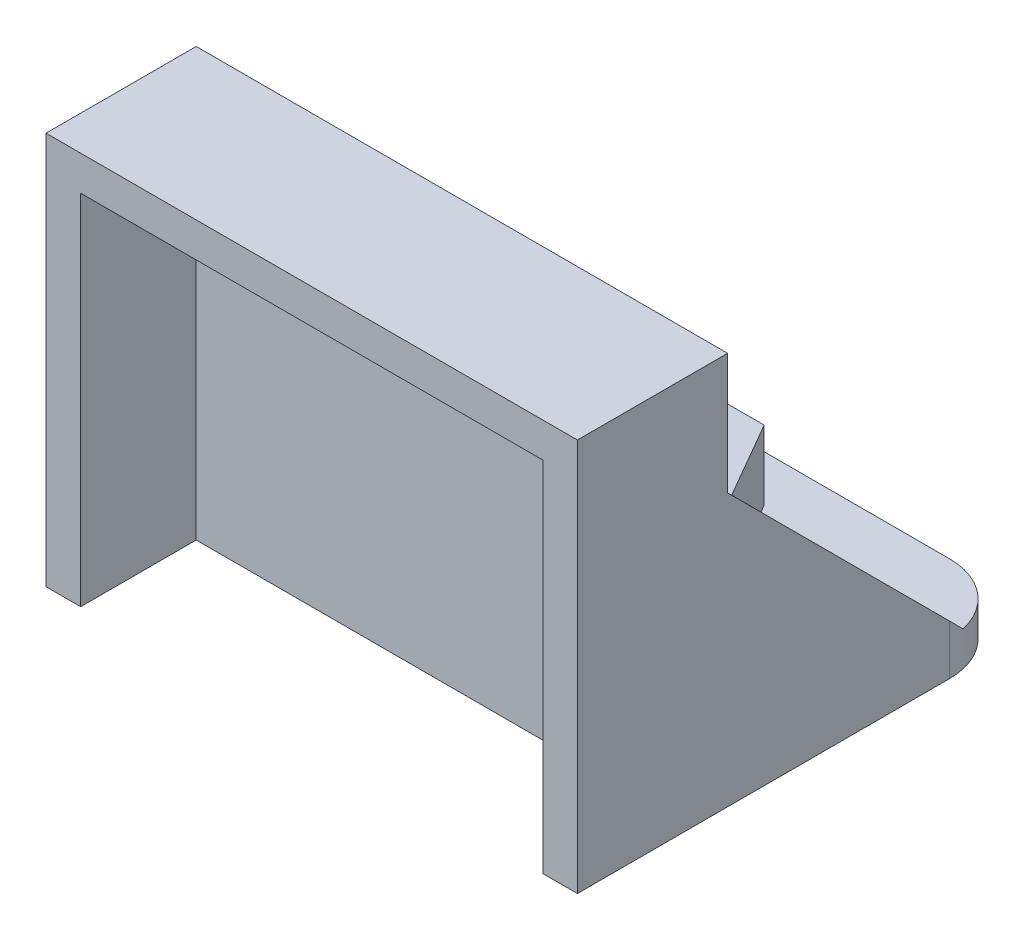
ISO-10303-21;
HEADER;
FILE_DESCRIPTION(('STEP AP214'),'2;1');
FILE_NAME('part.step','',(''),(''),'','','');
FILE_SCHEMA(('AUTOMOTIVE_DESIGN { 1 0 10303 214 1 1 1 1 }'));
ENDSEC;
DATA;
#1=APPLICATION_CONTEXT('core data for automotive mechanical design processes');
#2=APPLICATION_PROTOCOL_DEFINITION('international standard','automotive_design',2000,#1);
#3=PRODUCT_CONTEXT('',#1,'mechanical');
#4=PRODUCT('Part','Part','',(#3));
#5=PRODUCT_RELATED_PRODUCT_CATEGORY('part','',(#4));
#6=PRODUCT_DEFINITION_FORMATION('','',#4);
#7=PRODUCT_DEFINITION_CONTEXT('part definition',#1,'design');
#8=PRODUCT_DEFINITION('design','',#6,#7);
#9=PRODUCT_DEFINITION_SHAPE('','',#8);
#10=(LENGTH_UNIT() NAMED_UNIT(*) SI_UNIT(.MILLI.,.METRE.));
#11=(NAMED_UNIT(*) PLANE_ANGLE_UNIT() SI_UNIT($,.RADIAN.));
#12=(NAMED_UNIT(*) SI_UNIT($,.STERADIAN.) SOLID_ANGLE_UNIT());
#13=UNCERTAINTY_MEASURE_WITH_UNIT(LENGTH_MEASURE(1.E-05),#10,'distance_accuracy_value','');
#14=(GEOMETRIC_REPRESENTATION_CONTEXT(3) GLOBAL_UNCERTAINTY_ASSIGNED_CONTEXT((#13)) GLOBAL_UNIT_ASSIGNED_CONTEXT((#10,
#11,#12)) REPRESENTATION_CONTEXT('',''));
#15=CARTESIAN_POINT('',(0.,0.,0.));
#16=DIRECTION('',(0.,0.,1.));
#17=DIRECTION('',(1.,0.,0.));
#18=AXIS2_PLACEMENT_3D('',#15,#16,#17);
#19=CARTESIAN_POINT('',(11.5,-7.,-12.6));
#20=DIRECTION('',(0.,-1.,0.));
#21=DIRECTION('',(0.,0.,-1.));
#22=AXIS2_PLACEMENT_3D('',#19,#20,#21);
#23=PLANE('',#22);
#24=DIRECTION('',(0.5,0.,-0.866025403784439));
#25=VECTOR('',#24,1.);
#26=CARTESIAN_POINT('',(2.4826061575154,-7.,-2.));
#27=LINE('',#26,#25);
#28=CARTESIAN_POINT('',(2.4826061575154,-7.,-2.));
#29=VERTEX_POINT('',#28);
#30=CARTESIAN_POINT('',(4.96521231503081,-7.,-6.30000000000002));
#31=VERTEX_POINT('',#30);
#32=EDGE_CURVE('E309',#29,#31,#27,.T.);
#33=ORIENTED_EDGE('',*,*,#32,.F.);
#34=DIRECTION('',(1.,0.,0.));
#35=VECTOR('',#34,1.);
#36=CARTESIAN_POINT('',(-2.48260615751541,-7.,-2.));
#37=LINE('',#36,#35);
#38=CARTESIAN_POINT('',(-2.48260615751541,-7.,-2.));
#39=VERTEX_POINT('',#38);
#40=EDGE_CURVE('E314',#39,#29,#37,.T.);
#41=ORIENTED_EDGE('',*,*,#40,.F.);
#42=DIRECTION('',(0.5,0.,0.866025403784439));
#43=VECTOR('',#42,1.);
#44=CARTESIAN_POINT('',(-4.96521231503081,-7.,-6.30000000000003));
#45=LINE('',#44,#43);
#46=CARTESIAN_POINT('',(-4.96521231503081,-7.,-6.30000000000003));
#47=VERTEX_POINT('',#46);
#48=EDGE_CURVE('E336',#47,#39,#45,.T.);
#49=ORIENTED_EDGE('',*,*,#48,.F.);
#50=DIRECTION('',(-0.5,0.,0.866025403784439));
#51=VECTOR('',#50,1.);
#52=CARTESIAN_POINT('',(-2.48260615751541,-7.,-10.6));
#53=LINE('',#52,#51);
#54=CARTESIAN_POINT('',(-2.48260615751541,-7.,-10.6));
#55=VERTEX_POINT('',#54);
#56=EDGE_CURVE('E333',#55,#47,#53,.T.);
#57=ORIENTED_EDGE('',*,*,#56,.F.);
#58=DIRECTION('',(-1.,0.,0.));
#59=VECTOR('',#58,1.);
#60=CARTESIAN_POINT('',(2.4826061575154,-7.,-10.6));
#61=LINE('',#60,#59);
#62=CARTESIAN_POINT('',(2.4826061575154,-7.,-10.6));
#63=VERTEX_POINT('',#62);
#64=EDGE_CURVE('E330',#63,#55,#61,.T.);
#65=ORIENTED_EDGE('',*,*,#64,.F.);
#66=DIRECTION('',(-0.5,0.,-0.866025403784439));
#67=VECTOR('',#66,1.);
#68=CARTESIAN_POINT('',(4.96521231503081,-7.,-6.30000000000002));
#69=LINE('',#68,#67);
#70=EDGE_CURVE('E327',#31,#63,#69,.T.);
#71=ORIENTED_EDGE('',*,*,#70,.F.);
#72=EDGE_LOOP('',(#33,#41,#49,#57,#65,#71));
#73=FACE_BOUND('',#72,.T.);
#74=DIRECTION('',(1.,0.,0.));
#75=VECTOR('',#74,1.);
#76=CARTESIAN_POINT('',(11.5,-7.,-12.6));
#77=LINE('',#76,#75);
#78=CARTESIAN_POINT('',(-8.5,-7.,-12.6));
#79=VERTEX_POINT('',#78);
#80=CARTESIAN_POINT('',(8.5,-7.,-12.6));
#81=VERTEX_POINT('',#80);
#82=EDGE_CURVE('E361',#79,#81,#77,.T.);
#83=ORIENTED_EDGE('',*,*,#82,.F.);
#84=CARTESIAN_POINT('',(-8.5,-7.,-9.6));
#85=DIRECTION('',(0.,-1.,0.));
#86=DIRECTION('',(0.,0.,-1.));
#87=AXIS2_PLACEMENT_3D('',#84,#85,#86);
#88=CIRCLE('',#87,3.);
#89=CARTESIAN_POINT('',(-11.4249141286952,-7.,-10.2669912591324));
#90=VERTEX_POINT('',#89);
#91=EDGE_CURVE('E430',#79,#90,#88,.F.);
#92=ORIENTED_EDGE('',*,*,#91,.T.);
#93=DIRECTION('',(-1.,0.,0.));
#94=VECTOR('',#93,1.);
#95=CARTESIAN_POINT('',(-10.,-7.,-10.2669912591324));
#96=LINE('',#95,#94);
#97=CARTESIAN_POINT('',(-10.,-7.,-10.2669912591324));
#98=VERTEX_POINT('',#97);
#99=EDGE_CURVE('E235',#98,#90,#96,.T.);
#100=ORIENTED_EDGE('',*,*,#99,.F.);
#101=DIRECTION('',(0.,0.,-1.));
#102=VECTOR('',#101,1.);
#103=CARTESIAN_POINT('',(-10.,-7.,-8.894310991121));
#104=LINE('',#103,#102);
#105=CARTESIAN_POINT('',(-10.,-7.00000000000001,0.));
#106=VERTEX_POINT('',#105);
#107=EDGE_CURVE('E221',#106,#98,#104,.T.);
#108=ORIENTED_EDGE('',*,*,#107,.F.);
#109=DIRECTION('',(1.,0.,0.));
#110=VECTOR('',#109,1.);
#111=CARTESIAN_POINT('',(11.5,-7.,0.));
#112=LINE('',#111,#110);
#113=CARTESIAN_POINT('',(10.,-7.,0.));
#114=VERTEX_POINT('',#113);
#115=EDGE_CURVE('E240',#106,#114,#112,.T.);
#116=ORIENTED_EDGE('',*,*,#115,.T.);
#117=DIRECTION('',(0.,0.,-1.));
#118=VECTOR('',#117,1.);
#119=CARTESIAN_POINT('',(10.,-7.,-8.894310991121));
#120=LINE('',#119,#118);
#121=CARTESIAN_POINT('',(10.,-7.,-10.2669912591324));
#122=VERTEX_POINT('',#121);
#123=EDGE_CURVE('E253',#114,#122,#120,.T.);
#124=ORIENTED_EDGE('',*,*,#123,.T.);
#125=DIRECTION('',(1.,0.,0.));
#126=VECTOR('',#125,1.);
#127=CARTESIAN_POINT('',(10.,-7.,-10.2669912591324));
#128=LINE('',#127,#126);
#129=CARTESIAN_POINT('',(11.4249141286952,-7.,-10.2669912591324));
#130=VERTEX_POINT('',#129);
#131=EDGE_CURVE('E256',#122,#130,#128,.T.);
#132=ORIENTED_EDGE('',*,*,#131,.T.);
#133=CARTESIAN_POINT('',(8.5,-7.,-9.6));
#134=DIRECTION('',(0.,-1.,0.));
#135=DIRECTION('',(0.,0.,-1.));
#136=AXIS2_PLACEMENT_3D('',#133,#134,#135);
#137=CIRCLE('',#136,3.);
#138=EDGE_CURVE('E428',#130,#81,#137,.F.);
#139=ORIENTED_EDGE('',*,*,#138,.T.);
#140=EDGE_LOOP('',(#83,#92,#100,#108,#116,#124,#132,#139));
#141=FACE_BOUND('',#140,.T.);
#142=ADVANCED_FACE('F32',(#73,#141),#23,.F.);
#143=CARTESIAN_POINT('',(0.,0.,0.));
#144=DIRECTION('',(0.,0.,1.));
#145=DIRECTION('',(1.,0.,0.));
#146=AXIS2_PLACEMENT_3D('',#143,#144,#145);
#147=PLANE('',#146);
#148=DIRECTION('',(0.,1.,0.));
#149=VECTOR('',#148,1.);
#150=CARTESIAN_POINT('',(-10.,1.89431099112099,0.));
#151=LINE('',#150,#149);
#152=CARTESIAN_POINT('',(-10.,3.26699125913235,0.));
#153=VERTEX_POINT('',#152);
#154=EDGE_CURVE('E219',#106,#153,#151,.T.);
#155=ORIENTED_EDGE('',*,*,#154,.T.);
#156=DIRECTION('',(-1.,0.,0.));
#157=VECTOR('',#156,1.);
#158=CARTESIAN_POINT('',(-10.,3.26699125913235,0.));
#159=LINE('',#158,#157);
#160=CARTESIAN_POINT('',(-11.5,3.26699125913235,0.));
#161=VERTEX_POINT('',#160);
#162=EDGE_CURVE('E228',#153,#161,#159,.T.);
#163=ORIENTED_EDGE('',*,*,#162,.T.);
#164=DIRECTION('',(0.,-1.,0.));
#165=VECTOR('',#164,1.);
#166=CARTESIAN_POINT('',(-11.5,8.5,0.));
#167=LINE('',#166,#165);
#168=CARTESIAN_POINT('',(-11.5,8.5,0.));
#169=VERTEX_POINT('',#168);
#170=EDGE_CURVE('E399',#169,#161,#167,.T.);
#171=ORIENTED_EDGE('',*,*,#170,.F.);
#172=DIRECTION('',(-1.,0.,0.));
#173=VECTOR('',#172,1.);
#174=CARTESIAN_POINT('',(-11.5,8.5,0.));
#175=LINE('',#174,#173);
#176=CARTESIAN_POINT('',(11.5,8.5,0.));
#177=VERTEX_POINT('',#176);
#178=EDGE_CURVE('E409',#177,#169,#175,.T.);
#179=ORIENTED_EDGE('',*,*,#178,.F.);
#180=DIRECTION('',(0.,1.,0.));
#181=VECTOR('',#180,1.);
#182=CARTESIAN_POINT('',(11.5,8.5,0.));
#183=LINE('',#182,#181);
#184=CARTESIAN_POINT('',(11.5,3.26699125913235,0.));
#185=VERTEX_POINT('',#184);
#186=EDGE_CURVE('E387',#185,#177,#183,.T.);
#187=ORIENTED_EDGE('',*,*,#186,.F.);
#188=DIRECTION('',(1.,0.,0.));
#189=VECTOR('',#188,1.);
#190=CARTESIAN_POINT('',(10.,3.26699125913235,0.));
#191=LINE('',#190,#189);
#192=CARTESIAN_POINT('',(10.,3.26699125913235,0.));
#193=VERTEX_POINT('',#192);
#194=EDGE_CURVE('E225',#193,#185,#191,.T.);
#195=ORIENTED_EDGE('',*,*,#194,.F.);
#196=DIRECTION('',(0.,1.,0.));
#197=VECTOR('',#196,1.);
#198=CARTESIAN_POINT('',(10.,1.89431099112099,0.));
#199=LINE('',#198,#197);
#200=EDGE_CURVE('E250',#114,#193,#199,.T.);
#201=ORIENTED_EDGE('',*,*,#200,.F.);
#202=ORIENTED_EDGE('',*,*,#115,.F.);
#203=EDGE_LOOP('',(#155,#163,#171,#179,#187,#195,#201,#202));
#204=FACE_BOUND('',#203,.T.);
#205=ADVANCED_FACE('F238',(#204),#147,.F.);
#206=CARTESIAN_POINT('',(11.5,8.5,6.5));
#207=DIRECTION('',(-1.,0.,0.));
#208=DIRECTION('',(0.,-1.,0.));
#209=AXIS2_PLACEMENT_3D('',#206,#207,#208);
#210=PLANE('',#209);
#211=DIRECTION('',(0.,0.,-1.));
#212=VECTOR('',#211,1.);
#213=CARTESIAN_POINT('',(11.5,-8.5,6.5));
#214=LINE('',#213,#212);
#215=CARTESIAN_POINT('',(11.5,-8.5,6.5));
#216=VERTEX_POINT('',#215);
#217=CARTESIAN_POINT('',(11.5,-8.5,-9.59999999999999));
#218=VERTEX_POINT('',#217);
#219=EDGE_CURVE('E407',#216,#218,#214,.T.);
#220=ORIENTED_EDGE('',*,*,#219,.T.);
#221=DIRECTION('',(0.,-1.,0.));
#222=VECTOR('',#221,1.);
#223=CARTESIAN_POINT('',(11.5,-7.,-9.6));
#224=LINE('',#223,#222);
#225=CARTESIAN_POINT('',(11.5,-6.33300874086764,-9.6));
#226=VERTEX_POINT('',#225);
#227=EDGE_CURVE('E40',#218,#226,#224,.F.);
#228=ORIENTED_EDGE('',*,*,#227,.T.);
#229=DIRECTION('',(0.,0.707106781186547,0.707106781186548));
#230=VECTOR('',#229,1.);
#231=CARTESIAN_POINT('',(11.5,-10.7608153615548,-14.0278066206872));
#232=LINE('',#231,#230);
#233=EDGE_CURVE('E259',#226,#185,#232,.T.);
#234=ORIENTED_EDGE('',*,*,#233,.T.);
#235=ORIENTED_EDGE('',*,*,#186,.T.);
#236=DIRECTION('',(0.,0.,-1.));
#237=VECTOR('',#236,1.);
#238=CARTESIAN_POINT('',(11.5,8.5,6.5));
#239=LINE('',#238,#237);
#240=CARTESIAN_POINT('',(11.5,8.5,6.5));
#241=VERTEX_POINT('',#240);
#242=EDGE_CURVE('E419',#241,#177,#239,.T.);
#243=ORIENTED_EDGE('',*,*,#242,.F.);
#244=DIRECTION('',(0.,1.,0.));
#245=VECTOR('',#244,1.);
#246=CARTESIAN_POINT('',(11.5,8.5,6.5));
#247=LINE('',#246,#245);
#248=EDGE_CURVE('E395',#216,#241,#247,.T.);
#249=ORIENTED_EDGE('',*,*,#248,.F.);
#250=EDGE_LOOP('',(#220,#228,#234,#235,#243,#249));
#251=FACE_BOUND('',#250,.T.);
#252=ADVANCED_FACE('F463',(#251),#210,.F.);
#253=CARTESIAN_POINT('',(-11.5,8.5,6.5));
#254=DIRECTION('',(0.,-1.,0.));
#255=DIRECTION('',(0.,0.,-1.));
#256=AXIS2_PLACEMENT_3D('',#253,#254,#255);
#257=PLANE('',#256);
#258=ORIENTED_EDGE('',*,*,#178,.T.);
#259=DIRECTION('',(0.,0.,-1.));
#260=VECTOR('',#259,1.);
#261=CARTESIAN_POINT('',(-11.5,8.5,6.5));
#262=LINE('',#261,#260);
#263=CARTESIAN_POINT('',(-11.5,8.5,6.5));
#264=VERTEX_POINT('',#263);
#265=EDGE_CURVE('E416',#264,#169,#262,.T.);
#266=ORIENTED_EDGE('',*,*,#265,.F.);
#267=DIRECTION('',(-1.,0.,0.));
#268=VECTOR('',#267,1.);
#269=CARTESIAN_POINT('',(-11.5,8.5,6.5));
#270=LINE('',#269,#268);
#271=EDGE_CURVE('E398',#241,#264,#270,.T.);
#272=ORIENTED_EDGE('',*,*,#271,.F.);
#273=ORIENTED_EDGE('',*,*,#242,.T.);
#274=EDGE_LOOP('',(#258,#266,#272,#273));
#275=FACE_BOUND('',#274,.T.);
#276=ADVANCED_FACE('F461',(#275),#257,.F.);
#277=CARTESIAN_POINT('',(-11.5,8.5,6.5));
#278=DIRECTION('',(1.,0.,0.));
#279=DIRECTION('',(0.,1.,0.));
#280=AXIS2_PLACEMENT_3D('',#277,#278,#279);
#281=PLANE('',#280);
#282=DIRECTION('',(0.,0.707106781186547,0.707106781186548));
#283=VECTOR('',#282,1.);
#284=CARTESIAN_POINT('',(-11.5,-10.7608153615548,-14.0278066206872));
#285=LINE('',#284,#283);
#286=CARTESIAN_POINT('',(-11.5,-6.33300874086764,-9.6));
#287=VERTEX_POINT('',#286);
#288=EDGE_CURVE('E231',#287,#161,#285,.T.);
#289=ORIENTED_EDGE('',*,*,#288,.F.);
#290=DIRECTION('',(0.,1.,0.));
#291=VECTOR('',#290,1.);
#292=CARTESIAN_POINT('',(-11.5,-8.5,-9.6));
#293=LINE('',#292,#291);
#294=CARTESIAN_POINT('',(-11.5,-8.5,-9.59999999999999));
#295=VERTEX_POINT('',#294);
#296=EDGE_CURVE('E434',#287,#295,#293,.F.);
#297=ORIENTED_EDGE('',*,*,#296,.T.);
#298=DIRECTION('',(0.,0.,-1.));
#299=VECTOR('',#298,1.);
#300=CARTESIAN_POINT('',(-11.5,-8.5,6.5));
#301=LINE('',#300,#299);
#302=CARTESIAN_POINT('',(-11.5,-8.5,6.5));
#303=VERTEX_POINT('',#302);
#304=EDGE_CURVE('E413',#303,#295,#301,.T.);
#305=ORIENTED_EDGE('',*,*,#304,.F.);
#306=DIRECTION('',(0.,-1.,0.));
#307=VECTOR('',#306,1.);
#308=CARTESIAN_POINT('',(-11.5,8.5,6.5));
#309=LINE('',#308,#307);
#310=EDGE_CURVE('E401',#264,#303,#309,.T.);
#311=ORIENTED_EDGE('',*,*,#310,.F.);
#312=ORIENTED_EDGE('',*,*,#265,.T.);
#313=ORIENTED_EDGE('',*,*,#170,.T.);
#314=EDGE_LOOP('',(#289,#297,#305,#311,#312,#313));
#315=FACE_BOUND('',#314,.T.);
#316=ADVANCED_FACE('F453',(#315),#281,.F.);
#317=CARTESIAN_POINT('',(-11.5,-8.5,6.5));
#318=DIRECTION('',(0.,1.,0.));
#319=DIRECTION('',(0.,0.,1.));
#320=AXIS2_PLACEMENT_3D('',#317,#318,#319);
#321=PLANE('',#320);
#322=CARTESIAN_POINT('',(0.,-8.5,-6.30000000000002));
#323=DIRECTION('',(0.,1.,0.));
#324=DIRECTION('',(0.,0.,1.));
#325=AXIS2_PLACEMENT_3D('',#322,#323,#324);
#326=CIRCLE('',#325,1.6);
#327=CARTESIAN_POINT('',(0.,-8.5,-4.70000000000003));
#328=VERTEX_POINT('',#327);
#329=EDGE_CURVE('E241',#328,#328,#326,.T.);
#330=ORIENTED_EDGE('',*,*,#329,.T.);
#331=EDGE_LOOP('',(#330));
#332=FACE_BOUND('',#331,.T.);
#333=ORIENTED_EDGE('',*,*,#304,.T.);
#334=CARTESIAN_POINT('',(-8.5,-8.5,-9.6));
#335=DIRECTION('',(0.,1.,0.));
#336=DIRECTION('',(0.,0.,1.));
#337=AXIS2_PLACEMENT_3D('',#334,#335,#336);
#338=CIRCLE('',#337,3.);
#339=CARTESIAN_POINT('',(-8.5,-8.5,-12.6));
#340=VERTEX_POINT('',#339);
#341=EDGE_CURVE('E437',#295,#340,#338,.F.);
#342=ORIENTED_EDGE('',*,*,#341,.T.);
#343=DIRECTION('',(-1.,0.,0.));
#344=VECTOR('',#343,1.);
#345=CARTESIAN_POINT('',(11.5,-8.5,-12.6));
#346=LINE('',#345,#344);
#347=CARTESIAN_POINT('',(8.5,-8.5,-12.6));
#348=VERTEX_POINT('',#347);
#349=EDGE_CURVE('E358',#348,#340,#346,.T.);
#350=ORIENTED_EDGE('',*,*,#349,.F.);
#351=CARTESIAN_POINT('',(8.5,-8.5,-9.6));
#352=DIRECTION('',(0.,1.,0.));
#353=DIRECTION('',(0.,0.,1.));
#354=AXIS2_PLACEMENT_3D('',#351,#352,#353);
#355=CIRCLE('',#354,3.);
#356=EDGE_CURVE('E54',#348,#218,#355,.F.);
#357=ORIENTED_EDGE('',*,*,#356,.T.);
#358=ORIENTED_EDGE('',*,*,#219,.F.);
#359=DIRECTION('',(1.,0.,0.));
#360=VECTOR('',#359,1.);
#361=CARTESIAN_POINT('',(-11.5,-8.5,6.5));
#362=LINE('',#361,#360);
#363=CARTESIAN_POINT('',(10.,-8.5,6.5));
#364=VERTEX_POINT('',#363);
#365=EDGE_CURVE('E403',#364,#216,#362,.T.);
#366=ORIENTED_EDGE('',*,*,#365,.F.);
#367=DIRECTION('',(0.,0.,1.));
#368=VECTOR('',#367,1.);
#369=CARTESIAN_POINT('',(10.,-8.5,1.5));
#370=LINE('',#369,#368);
#371=CARTESIAN_POINT('',(10.,-8.5,1.5));
#372=VERTEX_POINT('',#371);
#373=EDGE_CURVE('E385',#372,#364,#370,.T.);
#374=ORIENTED_EDGE('',*,*,#373,.F.);
#375=DIRECTION('',(1.,0.,0.));
#376=VECTOR('',#375,1.);
#377=CARTESIAN_POINT('',(-10.,-8.5,1.5));
#378=LINE('',#377,#376);
#379=CARTESIAN_POINT('',(-10.,-8.5,1.5));
#380=VERTEX_POINT('',#379);
#381=EDGE_CURVE('E376',#380,#372,#378,.T.);
#382=ORIENTED_EDGE('',*,*,#381,.F.);
#383=DIRECTION('',(0.,0.,1.));
#384=VECTOR('',#383,1.);
#385=CARTESIAN_POINT('',(-10.,-8.5,1.5));
#386=LINE('',#385,#384);
#387=CARTESIAN_POINT('',(-10.,-8.5,6.5));
#388=VERTEX_POINT('',#387);
#389=EDGE_CURVE('E388',#380,#388,#386,.T.);
#390=ORIENTED_EDGE('',*,*,#389,.T.);
#391=EDGE_CURVE('E404',#303,#388,#362,.T.);
#392=ORIENTED_EDGE('',*,*,#391,.F.);
#393=EDGE_LOOP('',(#333,#342,#350,#357,#358,#366,#374,#382,#390,#392));
#394=FACE_BOUND('',#393,.T.);
#395=ADVANCED_FACE('F439',(#332,#394),#321,.F.);
#396=CARTESIAN_POINT('',(0.,0.,6.5));
#397=DIRECTION('',(0.,0.,1.));
#398=DIRECTION('',(1.,0.,0.));
#399=AXIS2_PLACEMENT_3D('',#396,#397,#398);
#400=PLANE('',#399);
#401=DIRECTION('',(0.,1.,0.));
#402=VECTOR('',#401,1.);
#403=CARTESIAN_POINT('',(10.,7.,6.5));
#404=LINE('',#403,#402);
#405=CARTESIAN_POINT('',(10.,7.,6.5));
#406=VERTEX_POINT('',#405);
#407=EDGE_CURVE('E364',#364,#406,#404,.T.);
#408=ORIENTED_EDGE('',*,*,#407,.F.);
#409=ORIENTED_EDGE('',*,*,#365,.T.);
#410=ORIENTED_EDGE('',*,*,#248,.T.);
#411=ORIENTED_EDGE('',*,*,#271,.T.);
#412=ORIENTED_EDGE('',*,*,#310,.T.);
#413=ORIENTED_EDGE('',*,*,#391,.T.);
#414=DIRECTION('',(0.,-1.,0.));
#415=VECTOR('',#414,1.);
#416=CARTESIAN_POINT('',(-10.,7.,6.5));
#417=LINE('',#416,#415);
#418=CARTESIAN_POINT('',(-10.,7.,6.5));
#419=VERTEX_POINT('',#418);
#420=EDGE_CURVE('E370',#419,#388,#417,.T.);
#421=ORIENTED_EDGE('',*,*,#420,.F.);
#422=DIRECTION('',(-1.,0.,0.));
#423=VECTOR('',#422,1.);
#424=CARTESIAN_POINT('',(-10.,7.,6.5));
#425=LINE('',#424,#423);
#426=EDGE_CURVE('E381',#406,#419,#425,.T.);
#427=ORIENTED_EDGE('',*,*,#426,.F.);
#428=EDGE_LOOP('',(#408,#409,#410,#411,#412,#413,#421,#427));
#429=FACE_BOUND('',#428,.T.);
#430=ADVANCED_FACE('F588',(#429),#400,.T.);
#431=CARTESIAN_POINT('',(10.,7.,1.5));
#432=DIRECTION('',(1.,0.,0.));
#433=DIRECTION('',(0.,1.,0.));
#434=AXIS2_PLACEMENT_3D('',#431,#432,#433);
#435=PLANE('',#434);
#436=ORIENTED_EDGE('',*,*,#407,.T.);
#437=DIRECTION('',(0.,0.,1.));
#438=VECTOR('',#437,1.);
#439=CARTESIAN_POINT('',(10.,7.,1.5));
#440=LINE('',#439,#438);
#441=CARTESIAN_POINT('',(10.,7.,1.5));
#442=VERTEX_POINT('',#441);
#443=EDGE_CURVE('E379',#442,#406,#440,.T.);
#444=ORIENTED_EDGE('',*,*,#443,.F.);
#445=DIRECTION('',(0.,1.,0.));
#446=VECTOR('',#445,1.);
#447=CARTESIAN_POINT('',(10.,7.,1.5));
#448=LINE('',#447,#446);
#449=EDGE_CURVE('E366',#372,#442,#448,.T.);
#450=ORIENTED_EDGE('',*,*,#449,.F.);
#451=ORIENTED_EDGE('',*,*,#373,.T.);
#452=EDGE_LOOP('',(#436,#444,#450,#451));
#453=FACE_BOUND('',#452,.T.);
#454=ADVANCED_FACE('F583',(#453),#435,.F.);
#455=CARTESIAN_POINT('',(-10.,7.,1.5));
#456=DIRECTION('',(-1.,0.,0.));
#457=DIRECTION('',(0.,0.,1.));
#458=AXIS2_PLACEMENT_3D('',#455,#456,#457);
#459=PLANE('',#458);
#460=ORIENTED_EDGE('',*,*,#420,.T.);
#461=ORIENTED_EDGE('',*,*,#389,.F.);
#462=DIRECTION('',(0.,-1.,0.));
#463=VECTOR('',#462,1.);
#464=CARTESIAN_POINT('',(-10.,7.,1.5));
#465=LINE('',#464,#463);
#466=CARTESIAN_POINT('',(-10.,7.,1.5));
#467=VERTEX_POINT('',#466);
#468=EDGE_CURVE('E373',#467,#380,#465,.T.);
#469=ORIENTED_EDGE('',*,*,#468,.F.);
#470=DIRECTION('',(0.,0.,1.));
#471=VECTOR('',#470,1.);
#472=CARTESIAN_POINT('',(-10.,7.,1.5));
#473=LINE('',#472,#471);
#474=EDGE_CURVE('E391',#467,#419,#473,.T.);
#475=ORIENTED_EDGE('',*,*,#474,.T.);
#476=EDGE_LOOP('',(#460,#461,#469,#475));
#477=FACE_BOUND('',#476,.T.);
#478=ADVANCED_FACE('F578',(#477),#459,.F.);
#479=CARTESIAN_POINT('',(-10.,7.,1.5));
#480=DIRECTION('',(0.,1.,0.));
#481=DIRECTION('',(0.,0.,1.));
#482=AXIS2_PLACEMENT_3D('',#479,#480,#481);
#483=PLANE('',#482);
#484=ORIENTED_EDGE('',*,*,#426,.T.);
#485=ORIENTED_EDGE('',*,*,#474,.F.);
#486=DIRECTION('',(-1.,0.,0.));
#487=VECTOR('',#486,1.);
#488=CARTESIAN_POINT('',(-10.,7.,1.5));
#489=LINE('',#488,#487);
#490=EDGE_CURVE('E369',#442,#467,#489,.T.);
#491=ORIENTED_EDGE('',*,*,#490,.F.);
#492=ORIENTED_EDGE('',*,*,#443,.T.);
#493=EDGE_LOOP('',(#484,#485,#491,#492));
#494=FACE_BOUND('',#493,.T.);
#495=ADVANCED_FACE('F573',(#494),#483,.F.);
#496=CARTESIAN_POINT('',(0.,0.,1.5));
#497=DIRECTION('',(0.,0.,1.));
#498=DIRECTION('',(1.,0.,0.));
#499=AXIS2_PLACEMENT_3D('',#496,#497,#498);
#500=PLANE('',#499);
#501=ORIENTED_EDGE('',*,*,#449,.T.);
#502=ORIENTED_EDGE('',*,*,#490,.T.);
#503=ORIENTED_EDGE('',*,*,#468,.T.);
#504=ORIENTED_EDGE('',*,*,#381,.T.);
#505=EDGE_LOOP('',(#501,#502,#503,#504));
#506=FACE_BOUND('',#505,.T.);
#507=ADVANCED_FACE('F569',(#506),#500,.T.);
#508=CARTESIAN_POINT('',(0.,0.,-12.6));
#509=DIRECTION('',(0.,0.,-1.));
#510=DIRECTION('',(-1.,0.,0.));
#511=AXIS2_PLACEMENT_3D('',#508,#509,#510);
#512=PLANE('',#511);
#513=ORIENTED_EDGE('',*,*,#349,.T.);
#514=DIRECTION('',(0.,1.,0.));
#515=VECTOR('',#514,1.);
#516=CARTESIAN_POINT('',(-8.5,-7.,-12.6));
#517=LINE('',#516,#515);
#518=EDGE_CURVE('E425',#340,#79,#517,.T.);
#519=ORIENTED_EDGE('',*,*,#518,.T.);
#520=ORIENTED_EDGE('',*,*,#82,.T.);
#521=DIRECTION('',(0.,-1.,0.));
#522=VECTOR('',#521,1.);
#523=CARTESIAN_POINT('',(8.5,-8.5,-12.6));
#524=LINE('',#523,#522);
#525=EDGE_CURVE('E422',#81,#348,#524,.T.);
#526=ORIENTED_EDGE('',*,*,#525,.T.);
#527=EDGE_LOOP('',(#513,#519,#520,#526));
#528=FACE_BOUND('',#527,.T.);
#529=ADVANCED_FACE('F446',(#528),#512,.T.);
#530=CARTESIAN_POINT('',(0.,-4.,0.));
#531=DIRECTION('',(0.,1.,0.));
#532=DIRECTION('',(0.,0.,1.));
#533=AXIS2_PLACEMENT_3D('',#530,#531,#532);
#534=PLANE('',#533);
#535=DIRECTION('',(0.5,0.,-0.866025403784439));
#536=VECTOR('',#535,1.);
#537=CARTESIAN_POINT('',(2.4826061575154,-4.,-2.));
#538=LINE('',#537,#536);
#539=CARTESIAN_POINT('',(2.4826061575154,-4.,-2.));
#540=VERTEX_POINT('',#539);
#541=CARTESIAN_POINT('',(4.96521231503081,-4.,-6.30000000000002));
#542=VERTEX_POINT('',#541);
#543=EDGE_CURVE('E310',#540,#542,#538,.T.);
#544=ORIENTED_EDGE('',*,*,#543,.T.);
#545=DIRECTION('',(-0.5,0.,-0.866025403784439));
#546=VECTOR('',#545,1.);
#547=CARTESIAN_POINT('',(4.96521231503081,-4.,-6.30000000000002));
#548=LINE('',#547,#546);
#549=CARTESIAN_POINT('',(2.4826061575154,-4.,-10.6));
#550=VERTEX_POINT('',#549);
#551=EDGE_CURVE('E313',#542,#550,#548,.T.);
#552=ORIENTED_EDGE('',*,*,#551,.T.);
#553=DIRECTION('',(-1.,0.,0.));
#554=VECTOR('',#553,1.);
#555=CARTESIAN_POINT('',(2.4826061575154,-4.,-10.6));
#556=LINE('',#555,#554);
#557=CARTESIAN_POINT('',(-2.48260615751541,-4.,-10.6));
#558=VERTEX_POINT('',#557);
#559=EDGE_CURVE('E316',#550,#558,#556,.T.);
#560=ORIENTED_EDGE('',*,*,#559,.T.);
#561=DIRECTION('',(-0.5,0.,0.866025403784439));
#562=VECTOR('',#561,1.);
#563=CARTESIAN_POINT('',(-2.48260615751541,-4.,-10.6));
#564=LINE('',#563,#562);
#565=CARTESIAN_POINT('',(-4.96521231503081,-4.,-6.30000000000003));
#566=VERTEX_POINT('',#565);
#567=EDGE_CURVE('E318',#558,#566,#564,.T.);
#568=ORIENTED_EDGE('',*,*,#567,.T.);
#569=DIRECTION('',(0.5,0.,0.866025403784439));
#570=VECTOR('',#569,1.);
#571=CARTESIAN_POINT('',(-4.96521231503081,-4.,-6.30000000000003));
#572=LINE('',#571,#570);
#573=CARTESIAN_POINT('',(-2.48260615751541,-4.,-2.));
#574=VERTEX_POINT('',#573);
#575=EDGE_CURVE('E320',#566,#574,#572,.T.);
#576=ORIENTED_EDGE('',*,*,#575,.T.);
#577=DIRECTION('',(1.,0.,0.));
#578=VECTOR('',#577,1.);
#579=CARTESIAN_POINT('',(-2.48260615751541,-4.,-2.));
#580=LINE('',#579,#578);
#581=EDGE_CURVE('E322',#574,#540,#580,.T.);
#582=ORIENTED_EDGE('',*,*,#581,.T.);
#583=EDGE_LOOP('',(#544,#552,#560,#568,#576,#582));
#584=FACE_BOUND('',#583,.T.);
#585=DIRECTION('',(-0.5,0.,-0.866025403784439));
#586=VECTOR('',#585,1.);
#587=CARTESIAN_POINT('',(3.23316150746193,-4.,-6.30000000000002));
#588=LINE('',#587,#586);
#589=CARTESIAN_POINT('',(3.23316150746193,-4.,-6.30000000000002));
#590=VERTEX_POINT('',#589);
#591=CARTESIAN_POINT('',(1.61658075373096,-4.,-9.10000000000005));
#592=VERTEX_POINT('',#591);
#593=EDGE_CURVE('E268',#590,#592,#588,.T.);
#594=ORIENTED_EDGE('',*,*,#593,.F.);
#595=DIRECTION('',(0.5,0.,-0.866025403784438));
#596=VECTOR('',#595,1.);
#597=CARTESIAN_POINT('',(1.61658075373097,-4.,-3.5));
#598=LINE('',#597,#596);
#599=CARTESIAN_POINT('',(1.61658075373097,-4.,-3.5));
#600=VERTEX_POINT('',#599);
#601=EDGE_CURVE('E266',#600,#590,#598,.T.);
#602=ORIENTED_EDGE('',*,*,#601,.F.);
#603=DIRECTION('',(1.,0.,0.));
#604=VECTOR('',#603,1.);
#605=CARTESIAN_POINT('',(-1.61658075373097,-4.,-3.5));
#606=LINE('',#605,#604);
#607=CARTESIAN_POINT('',(-1.61658075373097,-4.,-3.5));
#608=VERTEX_POINT('',#607);
#609=EDGE_CURVE('E278',#608,#600,#606,.T.);
#610=ORIENTED_EDGE('',*,*,#609,.F.);
#611=DIRECTION('',(0.5,0.,0.866025403784439));
#612=VECTOR('',#611,1.);
#613=CARTESIAN_POINT('',(-3.23316150746193,-4.,-6.30000000000003));
#614=LINE('',#613,#612);
#615=CARTESIAN_POINT('',(-3.23316150746193,-4.,-6.30000000000003));
#616=VERTEX_POINT('',#615);
#617=EDGE_CURVE('E275',#616,#608,#614,.T.);
#618=ORIENTED_EDGE('',*,*,#617,.F.);
#619=DIRECTION('',(-0.5,0.,0.866025403784439));
#620=VECTOR('',#619,1.);
#621=CARTESIAN_POINT('',(-1.61658075373097,-4.,-9.10000000000005));
#622=LINE('',#621,#620);
#623=CARTESIAN_POINT('',(-1.61658075373097,-4.,-9.10000000000005));
#624=VERTEX_POINT('',#623);
#625=EDGE_CURVE('E273',#624,#616,#622,.T.);
#626=ORIENTED_EDGE('',*,*,#625,.F.);
#627=DIRECTION('',(-1.,0.,0.));
#628=VECTOR('',#627,1.);
#629=CARTESIAN_POINT('',(1.61658075373096,-4.,-9.10000000000005));
#630=LINE('',#629,#628);
#631=EDGE_CURVE('E271',#592,#624,#630,.T.);
#632=ORIENTED_EDGE('',*,*,#631,.F.);
#633=EDGE_LOOP('',(#594,#602,#610,#618,#626,#632));
#634=FACE_BOUND('',#633,.T.);
#635=ADVANCED_FACE('F517',(#584,#634),#534,.T.);
#636=CARTESIAN_POINT('',(2.4826061575154,-4.,-2.));
#637=DIRECTION('',(-0.866025403784439,0.,-0.5));
#638=DIRECTION('',(-0.5,0.,0.866025403784439));
#639=AXIS2_PLACEMENT_3D('',#636,#637,#638);
#640=PLANE('',#639);
#641=ORIENTED_EDGE('',*,*,#32,.T.);
#642=DIRECTION('',(0.,-1.,0.));
#643=VECTOR('',#642,1.);
#644=CARTESIAN_POINT('',(4.96521231503081,-4.,-6.30000000000002));
#645=LINE('',#644,#643);
#646=EDGE_CURVE('E355',#542,#31,#645,.T.);
#647=ORIENTED_EDGE('',*,*,#646,.F.);
#648=ORIENTED_EDGE('',*,*,#543,.F.);
#649=DIRECTION('',(0.,-1.,0.));
#650=VECTOR('',#649,1.);
#651=CARTESIAN_POINT('',(2.4826061575154,-4.,-2.));
#652=LINE('',#651,#650);
#653=EDGE_CURVE('E324',#540,#29,#652,.T.);
#654=ORIENTED_EDGE('',*,*,#653,.T.);
#655=EDGE_LOOP('',(#641,#647,#648,#654));
#656=FACE_BOUND('',#655,.T.);
#657=ADVANCED_FACE('F545',(#656),#640,.F.);
#658=CARTESIAN_POINT('',(4.96521231503081,-4.,-6.30000000000002));
#659=DIRECTION('',(-0.866025403784439,0.,0.5));
#660=DIRECTION('',(0.5,0.,0.866025403784439));
#661=AXIS2_PLACEMENT_3D('',#658,#659,#660);
#662=PLANE('',#661);
#663=ORIENTED_EDGE('',*,*,#70,.T.);
#664=DIRECTION('',(0.,-1.,0.));
#665=VECTOR('',#664,1.);
#666=CARTESIAN_POINT('',(2.4826061575154,-4.,-10.6));
#667=LINE('',#666,#665);
#668=EDGE_CURVE('E352',#550,#63,#667,.T.);
#669=ORIENTED_EDGE('',*,*,#668,.F.);
#670=ORIENTED_EDGE('',*,*,#551,.F.);
#671=ORIENTED_EDGE('',*,*,#646,.T.);
#672=EDGE_LOOP('',(#663,#669,#670,#671));
#673=FACE_BOUND('',#672,.T.);
#674=ADVANCED_FACE('F561',(#673),#662,.F.);
#675=CARTESIAN_POINT('',(2.4826061575154,-4.,-10.6));
#676=DIRECTION('',(0.,0.,1.));
#677=DIRECTION('',(1.,0.,0.));
#678=AXIS2_PLACEMENT_3D('',#675,#676,#677);
#679=PLANE('',#678);
#680=ORIENTED_EDGE('',*,*,#64,.T.);
#681=DIRECTION('',(0.,-1.,0.));
#682=VECTOR('',#681,1.);
#683=CARTESIAN_POINT('',(-2.48260615751541,-4.,-10.6));
#684=LINE('',#683,#682);
#685=EDGE_CURVE('E349',#558,#55,#684,.T.);
#686=ORIENTED_EDGE('',*,*,#685,.F.);
#687=ORIENTED_EDGE('',*,*,#559,.F.);
#688=ORIENTED_EDGE('',*,*,#668,.T.);
#689=EDGE_LOOP('',(#680,#686,#687,#688));
#690=FACE_BOUND('',#689,.T.);
#691=ADVANCED_FACE('F557',(#690),#679,.F.);
#692=CARTESIAN_POINT('',(-2.48260615751541,-4.,-10.6));
#693=DIRECTION('',(0.866025403784439,0.,0.5));
#694=DIRECTION('',(0.5,0.,-0.866025403784439));
#695=AXIS2_PLACEMENT_3D('',#692,#693,#694);
#696=PLANE('',#695);
#697=ORIENTED_EDGE('',*,*,#56,.T.);
#698=DIRECTION('',(0.,-1.,0.));
#699=VECTOR('',#698,1.);
#700=CARTESIAN_POINT('',(-4.96521231503081,-4.,-6.30000000000003));
#701=LINE('',#700,#699);
#702=EDGE_CURVE('E346',#566,#47,#701,.T.);
#703=ORIENTED_EDGE('',*,*,#702,.F.);
#704=ORIENTED_EDGE('',*,*,#567,.F.);
#705=ORIENTED_EDGE('',*,*,#685,.T.);
#706=EDGE_LOOP('',(#697,#703,#704,#705));
#707=FACE_BOUND('',#706,.T.);
#708=ADVANCED_FACE('F553',(#707),#696,.F.);
#709=CARTESIAN_POINT('',(-4.96521231503081,-4.,-6.30000000000003));
#710=DIRECTION('',(0.866025403784439,0.,-0.5));
#711=DIRECTION('',(-0.5,0.,-0.866025403784439));
#712=AXIS2_PLACEMENT_3D('',#709,#710,#711);
#713=PLANE('',#712);
#714=ORIENTED_EDGE('',*,*,#48,.T.);
#715=DIRECTION('',(0.,-1.,0.));
#716=VECTOR('',#715,1.);
#717=CARTESIAN_POINT('',(-2.48260615751541,-4.,-2.));
#718=LINE('',#717,#716);
#719=EDGE_CURVE('E343',#574,#39,#718,.T.);
#720=ORIENTED_EDGE('',*,*,#719,.F.);
#721=ORIENTED_EDGE('',*,*,#575,.F.);
#722=ORIENTED_EDGE('',*,*,#702,.T.);
#723=EDGE_LOOP('',(#714,#720,#721,#722));
#724=FACE_BOUND('',#723,.T.);
#725=ADVANCED_FACE('F549',(#724),#713,.F.);
#726=CARTESIAN_POINT('',(-2.48260615751541,-4.,-2.));
#727=DIRECTION('',(0.,0.,-1.));
#728=DIRECTION('',(-1.,0.,0.));
#729=AXIS2_PLACEMENT_3D('',#726,#727,#728);
#730=PLANE('',#729);
#731=ORIENTED_EDGE('',*,*,#40,.T.);
#732=ORIENTED_EDGE('',*,*,#653,.F.);
#733=ORIENTED_EDGE('',*,*,#581,.F.);
#734=ORIENTED_EDGE('',*,*,#719,.T.);
#735=EDGE_LOOP('',(#731,#732,#733,#734));
#736=FACE_BOUND('',#735,.T.);
#737=ADVANCED_FACE('F542',(#736),#730,.F.);
#738=CARTESIAN_POINT('',(1.61658075373097,-4.,-3.5));
#739=DIRECTION('',(-0.866025403784439,0.,-0.5));
#740=DIRECTION('',(-0.5,0.,0.866025403784439));
#741=AXIS2_PLACEMENT_3D('',#738,#739,#740);
#742=PLANE('',#741);
#743=DIRECTION('',(0.5,0.,-0.866025403784438));
#744=VECTOR('',#743,1.);
#745=CARTESIAN_POINT('',(1.61658075373097,-7.,-3.5));
#746=LINE('',#745,#744);
#747=CARTESIAN_POINT('',(1.61658075373097,-7.,-3.5));
#748=VERTEX_POINT('',#747);
#749=CARTESIAN_POINT('',(3.23316150746193,-7.,-6.30000000000002));
#750=VERTEX_POINT('',#749);
#751=EDGE_CURVE('E264',#748,#750,#746,.T.);
#752=ORIENTED_EDGE('',*,*,#751,.F.);
#753=DIRECTION('',(0.,-1.,0.));
#754=VECTOR('',#753,1.);
#755=CARTESIAN_POINT('',(1.61658075373097,-4.,-3.5));
#756=LINE('',#755,#754);
#757=EDGE_CURVE('E280',#600,#748,#756,.T.);
#758=ORIENTED_EDGE('',*,*,#757,.F.);
#759=ORIENTED_EDGE('',*,*,#601,.T.);
#760=DIRECTION('',(0.,-1.,0.));
#761=VECTOR('',#760,1.);
#762=CARTESIAN_POINT('',(3.23316150746193,-4.,-6.30000000000002));
#763=LINE('',#762,#761);
#764=EDGE_CURVE('E306',#590,#750,#763,.T.);
#765=ORIENTED_EDGE('',*,*,#764,.T.);
#766=EDGE_LOOP('',(#752,#758,#759,#765));
#767=FACE_BOUND('',#766,.T.);
#768=ADVANCED_FACE('F509',(#767),#742,.T.);
#769=CARTESIAN_POINT('',(3.23316150746193,-4.,-6.30000000000002));
#770=DIRECTION('',(-0.866025403784438,0.,0.5));
#771=DIRECTION('',(0.5,0.,0.866025403784439));
#772=AXIS2_PLACEMENT_3D('',#769,#770,#771);
#773=PLANE('',#772);
#774=DIRECTION('',(-0.5,0.,-0.866025403784439));
#775=VECTOR('',#774,1.);
#776=CARTESIAN_POINT('',(3.23316150746193,-7.,-6.30000000000002));
#777=LINE('',#776,#775);
#778=CARTESIAN_POINT('',(1.61658075373096,-7.,-9.10000000000005));
#779=VERTEX_POINT('',#778);
#780=EDGE_CURVE('E283',#750,#779,#777,.T.);
#781=ORIENTED_EDGE('',*,*,#780,.F.);
#782=ORIENTED_EDGE('',*,*,#764,.F.);
#783=ORIENTED_EDGE('',*,*,#593,.T.);
#784=DIRECTION('',(0.,-1.,0.));
#785=VECTOR('',#784,1.);
#786=CARTESIAN_POINT('',(1.61658075373096,-4.,-9.10000000000005));
#787=LINE('',#786,#785);
#788=EDGE_CURVE('E304',#592,#779,#787,.T.);
#789=ORIENTED_EDGE('',*,*,#788,.T.);
#790=EDGE_LOOP('',(#781,#782,#783,#789));
#791=FACE_BOUND('',#790,.T.);
#792=ADVANCED_FACE('F513',(#791),#773,.T.);
#793=CARTESIAN_POINT('',(1.61658075373096,-4.,-9.10000000000005));
#794=DIRECTION('',(0.,0.,1.));
#795=DIRECTION('',(1.,0.,0.));
#796=AXIS2_PLACEMENT_3D('',#793,#794,#795);
#797=PLANE('',#796);
#798=DIRECTION('',(-1.,0.,0.));
#799=VECTOR('',#798,1.);
#800=CARTESIAN_POINT('',(1.61658075373096,-7.,-9.10000000000005));
#801=LINE('',#800,#799);
#802=CARTESIAN_POINT('',(-1.61658075373097,-7.,-9.10000000000005));
#803=VERTEX_POINT('',#802);
#804=EDGE_CURVE('E286',#779,#803,#801,.T.);
#805=ORIENTED_EDGE('',*,*,#804,.F.);
#806=ORIENTED_EDGE('',*,*,#788,.F.);
#807=ORIENTED_EDGE('',*,*,#631,.T.);
#808=DIRECTION('',(0.,-1.,0.));
#809=VECTOR('',#808,1.);
#810=CARTESIAN_POINT('',(-1.61658075373097,-4.,-9.10000000000005));
#811=LINE('',#810,#809);
#812=EDGE_CURVE('E302',#624,#803,#811,.T.);
#813=ORIENTED_EDGE('',*,*,#812,.T.);
#814=EDGE_LOOP('',(#805,#806,#807,#813));
#815=FACE_BOUND('',#814,.T.);
#816=ADVANCED_FACE('F523',(#815),#797,.T.);
#817=CARTESIAN_POINT('',(-1.61658075373097,-4.,-9.10000000000005));
#818=DIRECTION('',(0.866025403784439,0.,0.5));
#819=DIRECTION('',(0.5,0.,-0.866025403784439));
#820=AXIS2_PLACEMENT_3D('',#817,#818,#819);
#821=PLANE('',#820);
#822=DIRECTION('',(-0.5,0.,0.866025403784439));
#823=VECTOR('',#822,1.);
#824=CARTESIAN_POINT('',(-1.61658075373097,-7.,-9.10000000000005));
#825=LINE('',#824,#823);
#826=CARTESIAN_POINT('',(-3.23316150746193,-7.,-6.30000000000003));
#827=VERTEX_POINT('',#826);
#828=EDGE_CURVE('E289',#803,#827,#825,.T.);
#829=ORIENTED_EDGE('',*,*,#828,.F.);
#830=ORIENTED_EDGE('',*,*,#812,.F.);
#831=ORIENTED_EDGE('',*,*,#625,.T.);
#832=DIRECTION('',(0.,-1.,0.));
#833=VECTOR('',#832,1.);
#834=CARTESIAN_POINT('',(-3.23316150746193,-4.,-6.30000000000003));
#835=LINE('',#834,#833);
#836=EDGE_CURVE('E300',#616,#827,#835,.T.);
#837=ORIENTED_EDGE('',*,*,#836,.T.);
#838=EDGE_LOOP('',(#829,#830,#831,#837));
#839=FACE_BOUND('',#838,.T.);
#840=ADVANCED_FACE('F526',(#839),#821,.T.);
#841=CARTESIAN_POINT('',(-3.23316150746193,-4.,-6.30000000000003));
#842=DIRECTION('',(0.866025403784439,0.,-0.5));
#843=DIRECTION('',(-0.5,0.,-0.866025403784439));
#844=AXIS2_PLACEMENT_3D('',#841,#842,#843);
#845=PLANE('',#844);
#846=DIRECTION('',(0.5,0.,0.866025403784439));
#847=VECTOR('',#846,1.);
#848=CARTESIAN_POINT('',(-3.23316150746193,-7.,-6.30000000000003));
#849=LINE('',#848,#847);
#850=CARTESIAN_POINT('',(-1.61658075373097,-7.,-3.5));
#851=VERTEX_POINT('',#850);
#852=EDGE_CURVE('E292',#827,#851,#849,.T.);
#853=ORIENTED_EDGE('',*,*,#852,.F.);
#854=ORIENTED_EDGE('',*,*,#836,.F.);
#855=ORIENTED_EDGE('',*,*,#617,.T.);
#856=DIRECTION('',(0.,-1.,0.));
#857=VECTOR('',#856,1.);
#858=CARTESIAN_POINT('',(-1.61658075373097,-4.,-3.5));
#859=LINE('',#858,#857);
#860=EDGE_CURVE('E298',#608,#851,#859,.T.);
#861=ORIENTED_EDGE('',*,*,#860,.T.);
#862=EDGE_LOOP('',(#853,#854,#855,#861));
#863=FACE_BOUND('',#862,.T.);
#864=ADVANCED_FACE('F496',(#863),#845,.T.);
#865=CARTESIAN_POINT('',(-1.61658075373097,-4.,-3.5));
#866=DIRECTION('',(0.,0.,-1.));
#867=DIRECTION('',(-1.,0.,0.));
#868=AXIS2_PLACEMENT_3D('',#865,#866,#867);
#869=PLANE('',#868);
#870=DIRECTION('',(1.,0.,0.));
#871=VECTOR('',#870,1.);
#872=CARTESIAN_POINT('',(-1.61658075373097,-7.,-3.5));
#873=LINE('',#872,#871);
#874=EDGE_CURVE('E269',#851,#748,#873,.T.);
#875=ORIENTED_EDGE('',*,*,#874,.F.);
#876=ORIENTED_EDGE('',*,*,#860,.F.);
#877=ORIENTED_EDGE('',*,*,#609,.T.);
#878=ORIENTED_EDGE('',*,*,#757,.T.);
#879=EDGE_LOOP('',(#875,#876,#877,#878));
#880=FACE_BOUND('',#879,.T.);
#881=ADVANCED_FACE('F489',(#880),#869,.T.);
#882=CARTESIAN_POINT('',(0.,-7.,-6.30000000000002));
#883=DIRECTION('',(0.,1.,0.));
#884=DIRECTION('',(0.,0.,1.));
#885=AXIS2_PLACEMENT_3D('',#882,#883,#884);
#886=CIRCLE('',#885,1.6);
#887=CARTESIAN_POINT('',(0.,-7.,-4.70000000000003));
#888=VERTEX_POINT('',#887);
#889=EDGE_CURVE('E244',#888,#888,#886,.T.);
#890=ORIENTED_EDGE('',*,*,#889,.F.);
#891=EDGE_LOOP('',(#890));
#892=FACE_BOUND('',#891,.T.);
#893=ORIENTED_EDGE('',*,*,#874,.T.);
#894=ORIENTED_EDGE('',*,*,#751,.T.);
#895=ORIENTED_EDGE('',*,*,#780,.T.);
#896=ORIENTED_EDGE('',*,*,#804,.T.);
#897=ORIENTED_EDGE('',*,*,#828,.T.);
#898=ORIENTED_EDGE('',*,*,#852,.T.);
#899=EDGE_LOOP('',(#893,#894,#895,#896,#897,#898));
#900=FACE_BOUND('',#899,.T.);
#901=ADVANCED_FACE('F481',(#892,#900),#23,.F.);
#902=CARTESIAN_POINT('',(10.,-10.7608153615548,-14.0278066206872));
#903=DIRECTION('',(0.,-0.707106781186548,0.707106781186547));
#904=DIRECTION('',(0.,-0.707106781186547,-0.707106781186548));
#905=AXIS2_PLACEMENT_3D('',#902,#903,#904);
#906=PLANE('',#905);
#907=ORIENTED_EDGE('',*,*,#233,.F.);
#908=CARTESIAN_POINT('',(8.5,-6.33300874086764,-9.6));
#909=DIRECTION('',(0.,-0.707106781186548,0.707106781186547));
#910=DIRECTION('',(0.,0.707106781186547,0.707106781186548));
#911=AXIS2_PLACEMENT_3D('',#908,#909,#910);
#912=ELLIPSE('',#911,4.24264068711928,3.);
#913=EDGE_CURVE('E11',#226,#130,#912,.F.);
#914=ORIENTED_EDGE('',*,*,#913,.T.);
#915=ORIENTED_EDGE('',*,*,#131,.F.);
#916=DIRECTION('',(0.,0.707106781186547,0.707106781186548));
#917=VECTOR('',#916,1.);
#918=CARTESIAN_POINT('',(10.,-10.7608153615548,-14.0278066206872));
#919=LINE('',#918,#917);
#920=EDGE_CURVE('E262',#122,#193,#919,.T.);
#921=ORIENTED_EDGE('',*,*,#920,.T.);
#922=ORIENTED_EDGE('',*,*,#194,.T.);
#923=EDGE_LOOP('',(#907,#914,#915,#921,#922));
#924=FACE_BOUND('',#923,.T.);
#925=ADVANCED_FACE('F466',(#924),#906,.F.);
#926=CARTESIAN_POINT('',(10.,-15.894310991121,-8.894310991121));
#927=DIRECTION('',(1.,0.,0.));
#928=DIRECTION('',(0.,0.,-1.));
#929=AXIS2_PLACEMENT_3D('',#926,#927,#928);
#930=PLANE('',#929);
#931=ORIENTED_EDGE('',*,*,#123,.F.);
#932=ORIENTED_EDGE('',*,*,#200,.T.);
#933=ORIENTED_EDGE('',*,*,#920,.F.);
#934=EDGE_LOOP('',(#931,#932,#933));
#935=FACE_BOUND('',#934,.T.);
#936=ADVANCED_FACE('F470',(#935),#930,.F.);
#937=CARTESIAN_POINT('',(-10.,-10.7608153615548,-14.0278066206872));
#938=DIRECTION('',(0.,0.707106781186548,-0.707106781186547));
#939=DIRECTION('',(0.,0.707106781186547,0.707106781186548));
#940=AXIS2_PLACEMENT_3D('',#937,#938,#939);
#941=PLANE('',#940);
#942=ORIENTED_EDGE('',*,*,#99,.T.);
#943=CARTESIAN_POINT('',(-8.5,-6.33300874086765,-9.6));
#944=DIRECTION('',(0.,0.707106781186548,-0.707106781186547));
#945=DIRECTION('',(0.,-0.707106781186547,-0.707106781186548));
#946=AXIS2_PLACEMENT_3D('',#943,#944,#945);
#947=ELLIPSE('',#946,4.24264068711928,3.);
#948=EDGE_CURVE('E432',#90,#287,#947,.T.);
#949=ORIENTED_EDGE('',*,*,#948,.T.);
#950=ORIENTED_EDGE('',*,*,#288,.T.);
#951=ORIENTED_EDGE('',*,*,#162,.F.);
#952=DIRECTION('',(0.,0.707106781186547,0.707106781186548));
#953=VECTOR('',#952,1.);
#954=CARTESIAN_POINT('',(-10.,-10.7608153615548,-14.0278066206872));
#955=LINE('',#954,#953);
#956=EDGE_CURVE('E215',#98,#153,#955,.T.);
#957=ORIENTED_EDGE('',*,*,#956,.F.);
#958=EDGE_LOOP('',(#942,#949,#950,#951,#957));
#959=FACE_BOUND('',#958,.T.);
#960=ADVANCED_FACE('F229',(#959),#941,.T.);
#961=CARTESIAN_POINT('',(-10.,-15.894310991121,-8.894310991121));
#962=DIRECTION('',(1.,0.,0.));
#963=DIRECTION('',(0.,0.,-1.));
#964=AXIS2_PLACEMENT_3D('',#961,#962,#963);
#965=PLANE('',#964);
#966=ORIENTED_EDGE('',*,*,#956,.T.);
#967=ORIENTED_EDGE('',*,*,#154,.F.);
#968=ORIENTED_EDGE('',*,*,#107,.T.);
#969=EDGE_LOOP('',(#966,#967,#968));
#970=FACE_BOUND('',#969,.T.);
#971=ADVANCED_FACE('F217',(#970),#965,.T.);
#972=CARTESIAN_POINT('',(0.,-7.,-6.30000000000002));
#973=DIRECTION('',(0.,1.,0.));
#974=DIRECTION('',(0.,0.,1.));
#975=AXIS2_PLACEMENT_3D('',#972,#973,#974);
#976=CYLINDRICAL_SURFACE('',#975,1.6);
#977=ORIENTED_EDGE('',*,*,#329,.F.);
#978=EDGE_LOOP('',(#977));
#979=FACE_BOUND('',#978,.T.);
#980=ORIENTED_EDGE('',*,*,#889,.T.);
#981=EDGE_LOOP('',(#980));
#982=FACE_BOUND('',#981,.T.);
#983=ADVANCED_FACE('F477',(#979,#982),#976,.F.);
#984=CARTESIAN_POINT('',(-8.5,0.,-9.6));
#985=DIRECTION('',(0.,-1.,0.));
#986=DIRECTION('',(1.,0.,0.));
#987=AXIS2_PLACEMENT_3D('',#984,#985,#986);
#988=CYLINDRICAL_SURFACE('',#987,3.);
#989=ORIENTED_EDGE('',*,*,#341,.F.);
#990=ORIENTED_EDGE('',*,*,#296,.F.);
#991=ORIENTED_EDGE('',*,*,#948,.F.);
#992=ORIENTED_EDGE('',*,*,#91,.F.);
#993=ORIENTED_EDGE('',*,*,#518,.F.);
#994=EDGE_LOOP('',(#989,#990,#991,#992,#993));
#995=FACE_BOUND('',#994,.T.);
#996=ADVANCED_FACE('F449',(#995),#988,.T.);
#997=CARTESIAN_POINT('',(8.5,0.,-9.6));
#998=DIRECTION('',(0.,1.,0.));
#999=DIRECTION('',(-1.,0.,0.));
#1000=AXIS2_PLACEMENT_3D('',#997,#998,#999);
#1001=CYLINDRICAL_SURFACE('',#1000,3.);
#1002=ORIENTED_EDGE('',*,*,#913,.F.);
#1003=ORIENTED_EDGE('',*,*,#227,.F.);
#1004=ORIENTED_EDGE('',*,*,#356,.F.);
#1005=ORIENTED_EDGE('',*,*,#525,.F.);
#1006=ORIENTED_EDGE('',*,*,#138,.F.);
#1007=EDGE_LOOP('',(#1002,#1003,#1004,#1005,#1006));
#1008=FACE_BOUND('',#1007,.T.);
#1009=ADVANCED_FACE('F34',(#1008),#1001,.T.);
#1010=CLOSED_SHELL('',(#142,#205,#252,#276,#316,#395,#430,#454,#478,#495,#507,#529,#635,#657,
#674,#691,#708,#725,#737,#768,#792,#816,#840,#864,#881,#901,#925,#936,#960,#971,#983,#996,#1009));
#1011=MANIFOLD_SOLID_BREP('B2',#1010);
#1012=ADVANCED_BREP_SHAPE_REPRESENTATION('',(#18,#1011),#14);
#1013=SHAPE_DEFINITION_REPRESENTATION(#9,#1012);
ENDSEC;
END-ISO-10303-21;
